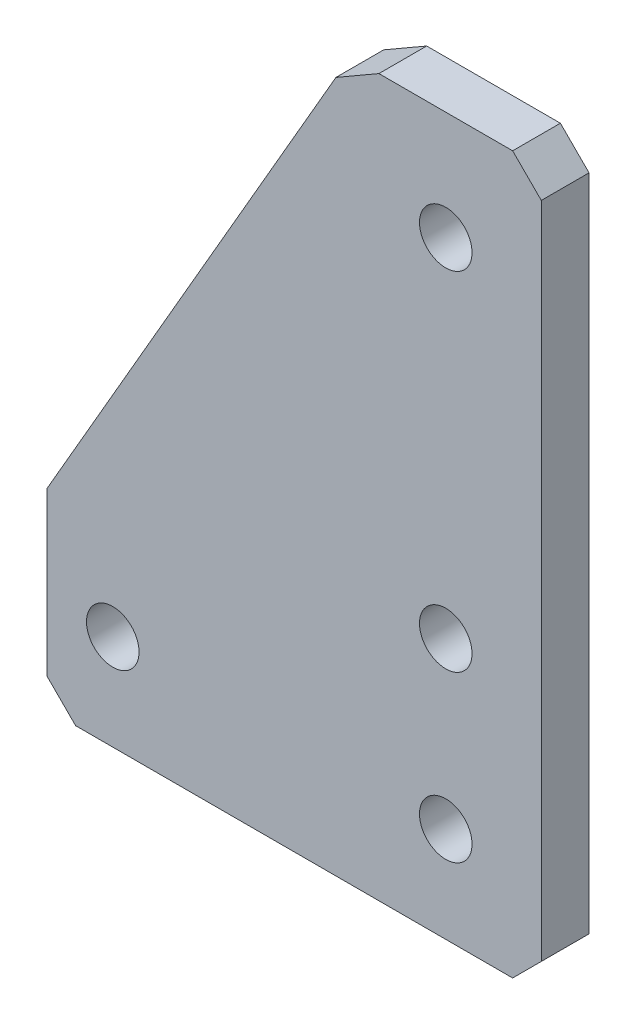
ISO-10303-21;
HEADER;
FILE_DESCRIPTION(('STEP AP214'),'2;1');
FILE_NAME('part.step','',(''),(''),'','','');
FILE_SCHEMA(('AUTOMOTIVE_DESIGN { 1 0 10303 214 1 1 1 1 }'));
ENDSEC;
DATA;
#1=APPLICATION_CONTEXT('core data for automotive mechanical design processes');
#2=APPLICATION_PROTOCOL_DEFINITION('international standard','automotive_design',2000,#1);
#3=PRODUCT_CONTEXT('',#1,'mechanical');
#4=PRODUCT('Part','Part','',(#3));
#5=PRODUCT_RELATED_PRODUCT_CATEGORY('part','',(#4));
#6=PRODUCT_DEFINITION_FORMATION('','',#4);
#7=PRODUCT_DEFINITION_CONTEXT('part definition',#1,'design');
#8=PRODUCT_DEFINITION('design','',#6,#7);
#9=PRODUCT_DEFINITION_SHAPE('','',#8);
#10=(LENGTH_UNIT() NAMED_UNIT(*) SI_UNIT(.MILLI.,.METRE.));
#11=(NAMED_UNIT(*) PLANE_ANGLE_UNIT() SI_UNIT($,.RADIAN.));
#12=(NAMED_UNIT(*) SI_UNIT($,.STERADIAN.) SOLID_ANGLE_UNIT());
#13=UNCERTAINTY_MEASURE_WITH_UNIT(LENGTH_MEASURE(1.E-05),#10,'distance_accuracy_value','');
#14=(GEOMETRIC_REPRESENTATION_CONTEXT(3) GLOBAL_UNCERTAINTY_ASSIGNED_CONTEXT((#13)) GLOBAL_UNIT_ASSIGNED_CONTEXT((#10,
#11,#12)) REPRESENTATION_CONTEXT('',''));
#15=CARTESIAN_POINT('',(0.,0.,0.));
#16=DIRECTION('',(0.,0.,1.));
#17=DIRECTION('',(1.,0.,0.));
#18=AXIS2_PLACEMENT_3D('',#15,#16,#17);
#19=CARTESIAN_POINT('',(445.331056745974,-91.9406540029195,842.256699137521));
#20=DIRECTION('',(1.,0.,0.));
#21=DIRECTION('',(0.,0.,-1.));
#22=AXIS2_PLACEMENT_3D('',#19,#20,#21);
#23=PLANE('',#22);
#24=DIRECTION('',(0.,1.,0.));
#25=VECTOR('',#24,1.);
#26=CARTESIAN_POINT('',(445.331056745974,-91.9406540029195,847.256699137521));
#27=LINE('',#26,#25);
#28=CARTESIAN_POINT('',(445.331056745974,-88.9406540029196,847.256699137521));
#29=VERTEX_POINT('',#28);
#30=CARTESIAN_POINT('',(445.331056745974,-19.9406540029195,847.256699137521));
#31=VERTEX_POINT('',#30);
#32=EDGE_CURVE('E152',#29,#31,#27,.T.);
#33=ORIENTED_EDGE('',*,*,#32,.F.);
#34=DIRECTION('',(0.,0.,-1.));
#35=VECTOR('',#34,1.);
#36=CARTESIAN_POINT('',(445.331056745974,-88.9406540029196,842.256699137521));
#37=LINE('',#36,#35);
#38=CARTESIAN_POINT('',(445.331056745974,-88.9406540029196,842.256699137521));
#39=VERTEX_POINT('',#38);
#40=EDGE_CURVE('E181',#29,#39,#37,.T.);
#41=ORIENTED_EDGE('',*,*,#40,.T.);
#42=DIRECTION('',(0.,1.,0.));
#43=VECTOR('',#42,1.);
#44=CARTESIAN_POINT('',(445.331056745974,-91.9406540029195,842.256699137521));
#45=LINE('',#44,#43);
#46=CARTESIAN_POINT('',(445.331056745974,-19.9406540029195,842.256699137521));
#47=VERTEX_POINT('',#46);
#48=EDGE_CURVE('E164',#39,#47,#45,.T.);
#49=ORIENTED_EDGE('',*,*,#48,.T.);
#50=DIRECTION('',(0.,0.,1.));
#51=VECTOR('',#50,1.);
#52=CARTESIAN_POINT('',(445.331056745974,-19.9406540029195,842.256699137521));
#53=LINE('',#52,#51);
#54=EDGE_CURVE('E178',#47,#31,#53,.T.);
#55=ORIENTED_EDGE('',*,*,#54,.T.);
#56=EDGE_LOOP('',(#33,#41,#49,#55));
#57=FACE_BOUND('',#56,.T.);
#58=ADVANCED_FACE('F51',(#57),#23,.T.);
#59=CARTESIAN_POINT('',(393.576791940545,-91.9406540029195,842.256699137521));
#60=DIRECTION('',(0.,-1.,0.));
#61=DIRECTION('',(1.,0.,0.));
#62=AXIS2_PLACEMENT_3D('',#59,#60,#61);
#63=PLANE('',#62);
#64=DIRECTION('',(1.,0.,0.));
#65=VECTOR('',#64,1.);
#66=CARTESIAN_POINT('',(393.576791940545,-91.9406540029195,842.256699137521));
#67=LINE('',#66,#65);
#68=CARTESIAN_POINT('',(396.576791940545,-91.9406540029195,842.256699137521));
#69=VERTEX_POINT('',#68);
#70=CARTESIAN_POINT('',(442.331056745974,-91.9406540029195,842.256699137521));
#71=VERTEX_POINT('',#70);
#72=EDGE_CURVE('E140',#69,#71,#67,.T.);
#73=ORIENTED_EDGE('',*,*,#72,.T.);
#74=DIRECTION('',(0.,0.,1.));
#75=VECTOR('',#74,1.);
#76=CARTESIAN_POINT('',(442.331056745974,-91.9406540029195,842.256699137521));
#77=LINE('',#76,#75);
#78=CARTESIAN_POINT('',(442.331056745974,-91.9406540029195,847.256699137521));
#79=VERTEX_POINT('',#78);
#80=EDGE_CURVE('E167',#71,#79,#77,.T.);
#81=ORIENTED_EDGE('',*,*,#80,.T.);
#82=DIRECTION('',(1.,0.,0.));
#83=VECTOR('',#82,1.);
#84=CARTESIAN_POINT('',(393.576791940545,-91.9406540029195,847.256699137521));
#85=LINE('',#84,#83);
#86=CARTESIAN_POINT('',(396.576791940545,-91.9406540029195,847.256699137521));
#87=VERTEX_POINT('',#86);
#88=EDGE_CURVE('E162',#87,#79,#85,.T.);
#89=ORIENTED_EDGE('',*,*,#88,.F.);
#90=DIRECTION('',(0.,0.,-1.));
#91=VECTOR('',#90,1.);
#92=CARTESIAN_POINT('',(396.576791940545,-91.9406540029195,842.256699137521));
#93=LINE('',#92,#91);
#94=EDGE_CURVE('E139',#87,#69,#93,.T.);
#95=ORIENTED_EDGE('',*,*,#94,.T.);
#96=EDGE_LOOP('',(#73,#81,#89,#95));
#97=FACE_BOUND('',#96,.T.);
#98=ADVANCED_FACE('F265',(#97),#63,.T.);
#99=CARTESIAN_POINT('',(393.576791940545,-71.9406540029195,842.256699137521));
#100=DIRECTION('',(-1.,0.,0.));
#101=DIRECTION('',(0.,-1.,0.));
#102=AXIS2_PLACEMENT_3D('',#99,#100,#101);
#103=PLANE('',#102);
#104=DIRECTION('',(0.,-1.,0.));
#105=VECTOR('',#104,1.);
#106=CARTESIAN_POINT('',(393.576791940545,-71.9406540029195,842.256699137521));
#107=LINE('',#106,#105);
#108=CARTESIAN_POINT('',(393.576791940545,-71.9406540029195,842.256699137521));
#109=VERTEX_POINT('',#108);
#110=CARTESIAN_POINT('',(393.576791940545,-88.9406540029195,842.256699137521));
#111=VERTEX_POINT('',#110);
#112=EDGE_CURVE('E129',#109,#111,#107,.T.);
#113=ORIENTED_EDGE('',*,*,#112,.T.);
#114=DIRECTION('',(0.,0.,1.));
#115=VECTOR('',#114,1.);
#116=CARTESIAN_POINT('',(393.576791940545,-88.9406540029195,842.256699137521));
#117=LINE('',#116,#115);
#118=CARTESIAN_POINT('',(393.576791940545,-88.9406540029195,847.256699137521));
#119=VERTEX_POINT('',#118);
#120=EDGE_CURVE('E189',#111,#119,#117,.T.);
#121=ORIENTED_EDGE('',*,*,#120,.T.);
#122=DIRECTION('',(0.,-1.,0.));
#123=VECTOR('',#122,1.);
#124=CARTESIAN_POINT('',(393.576791940545,-71.9406540029195,847.256699137521));
#125=LINE('',#124,#123);
#126=CARTESIAN_POINT('',(393.576791940545,-71.9406540029195,847.256699137521));
#127=VERTEX_POINT('',#126);
#128=EDGE_CURVE('E138',#127,#119,#125,.T.);
#129=ORIENTED_EDGE('',*,*,#128,.F.);
#130=DIRECTION('',(0.,0.,1.));
#131=VECTOR('',#130,1.);
#132=CARTESIAN_POINT('',(393.576791940545,-71.9406540029195,842.256699137521));
#133=LINE('',#132,#131);
#134=EDGE_CURVE('E125',#109,#127,#133,.T.);
#135=ORIENTED_EDGE('',*,*,#134,.F.);
#136=EDGE_LOOP('',(#113,#121,#129,#135));
#137=FACE_BOUND('',#136,.T.);
#138=ADVANCED_FACE('F134',(#137),#103,.T.);
#139=CARTESIAN_POINT('',(425.331056745974,-16.9406540029195,842.256699137521));
#140=DIRECTION('',(-0.866025403784438,0.5,0.));
#141=DIRECTION('',(-0.5,-0.866025403784438,0.));
#142=AXIS2_PLACEMENT_3D('',#139,#140,#141);
#143=PLANE('',#142);
#144=DIRECTION('',(-0.5,-0.866025403784438,0.));
#145=VECTOR('',#144,1.);
#146=CARTESIAN_POINT('',(425.331056745974,-16.9406540029195,847.256699137521));
#147=LINE('',#146,#145);
#148=CARTESIAN_POINT('',(423.831056745974,-19.5387302142728,847.256699137521));
#149=VERTEX_POINT('',#148);
#150=EDGE_CURVE('E159',#149,#127,#147,.T.);
#151=ORIENTED_EDGE('',*,*,#150,.F.);
#152=DIRECTION('',(0.,0.,-1.));
#153=VECTOR('',#152,1.);
#154=CARTESIAN_POINT('',(423.831056745974,-19.5387302142728,842.256699137521));
#155=LINE('',#154,#153);
#156=CARTESIAN_POINT('',(423.831056745974,-19.5387302142728,842.256699137521));
#157=VERTEX_POINT('',#156);
#158=EDGE_CURVE('E13',#149,#157,#155,.T.);
#159=ORIENTED_EDGE('',*,*,#158,.T.);
#160=DIRECTION('',(-0.5,-0.866025403784438,0.));
#161=VECTOR('',#160,1.);
#162=CARTESIAN_POINT('',(425.331056745974,-16.9406540029195,842.256699137521));
#163=LINE('',#162,#161);
#164=EDGE_CURVE('E121',#157,#109,#163,.T.);
#165=ORIENTED_EDGE('',*,*,#164,.T.);
#166=ORIENTED_EDGE('',*,*,#134,.T.);
#167=EDGE_LOOP('',(#151,#159,#165,#166));
#168=FACE_BOUND('',#167,.T.);
#169=ADVANCED_FACE('F124',(#168),#143,.T.);
#170=CARTESIAN_POINT('',(445.331056745974,-16.9406540029195,842.256699137521));
#171=DIRECTION('',(0.,1.,0.));
#172=DIRECTION('',(-1.,0.,0.));
#173=AXIS2_PLACEMENT_3D('',#170,#171,#172);
#174=PLANE('',#173);
#175=DIRECTION('',(-1.,0.,0.));
#176=VECTOR('',#175,1.);
#177=CARTESIAN_POINT('',(445.331056745974,-16.9406540029195,847.256699137521));
#178=LINE('',#177,#176);
#179=CARTESIAN_POINT('',(442.331056745974,-16.9406540029195,847.256699137521));
#180=VERTEX_POINT('',#179);
#181=CARTESIAN_POINT('',(428.331056745974,-16.9406540029195,847.256699137521));
#182=VERTEX_POINT('',#181);
#183=EDGE_CURVE('E155',#180,#182,#178,.T.);
#184=ORIENTED_EDGE('',*,*,#183,.F.);
#185=DIRECTION('',(0.,0.,-1.));
#186=VECTOR('',#185,1.);
#187=CARTESIAN_POINT('',(442.331056745974,-16.9406540029195,842.256699137521));
#188=LINE('',#187,#186);
#189=CARTESIAN_POINT('',(442.331056745974,-16.9406540029195,842.256699137521));
#190=VERTEX_POINT('',#189);
#191=EDGE_CURVE('E59',#180,#190,#188,.T.);
#192=ORIENTED_EDGE('',*,*,#191,.T.);
#193=DIRECTION('',(-1.,0.,0.));
#194=VECTOR('',#193,1.);
#195=CARTESIAN_POINT('',(445.331056745974,-16.9406540029195,842.256699137521));
#196=LINE('',#195,#194);
#197=CARTESIAN_POINT('',(428.331056745974,-16.9406540029195,842.256699137521));
#198=VERTEX_POINT('',#197);
#199=EDGE_CURVE('E130',#190,#198,#196,.T.);
#200=ORIENTED_EDGE('',*,*,#199,.T.);
#201=DIRECTION('',(0.,0.,1.));
#202=VECTOR('',#201,1.);
#203=CARTESIAN_POINT('',(428.331056745974,-16.9406540029195,842.256699137521));
#204=LINE('',#203,#202);
#205=EDGE_CURVE('E191',#198,#182,#204,.T.);
#206=ORIENTED_EDGE('',*,*,#205,.T.);
#207=EDGE_LOOP('',(#184,#192,#200,#206));
#208=FACE_BOUND('',#207,.T.);
#209=ADVANCED_FACE('F194',(#208),#174,.T.);
#210=CARTESIAN_POINT('',(0.,0.,842.256699137521));
#211=DIRECTION('',(0.,0.,1.));
#212=DIRECTION('',(1.,0.,0.));
#213=AXIS2_PLACEMENT_3D('',#210,#211,#212);
#214=PLANE('',#213);
#215=CARTESIAN_POINT('',(435.331056745974,-81.9406540029195,842.256699137521));
#216=DIRECTION('',(0.,0.,1.));
#217=DIRECTION('',(-1.,0.,0.));
#218=AXIS2_PLACEMENT_3D('',#215,#216,#217);
#219=CIRCLE('',#218,2.74999999999998);
#220=CARTESIAN_POINT('',(432.581056745974,-81.9406540029195,842.256699137521));
#221=VERTEX_POINT('',#220);
#222=EDGE_CURVE('E224',#221,#221,#219,.T.);
#223=ORIENTED_EDGE('',*,*,#222,.T.);
#224=EDGE_LOOP('',(#223));
#225=FACE_BOUND('',#224,.T.);
#226=CARTESIAN_POINT('',(400.469639923236,-81.9406540029195,842.256699137521));
#227=DIRECTION('',(0.,0.,1.));
#228=DIRECTION('',(-1.,0.,0.));
#229=AXIS2_PLACEMENT_3D('',#226,#227,#228);
#230=CIRCLE('',#229,2.74999999999998);
#231=CARTESIAN_POINT('',(397.719639923236,-81.9406540029195,842.256699137521));
#232=VERTEX_POINT('',#231);
#233=EDGE_CURVE('E218',#232,#232,#230,.T.);
#234=ORIENTED_EDGE('',*,*,#233,.T.);
#235=EDGE_LOOP('',(#234));
#236=FACE_BOUND('',#235,.T.);
#237=CARTESIAN_POINT('',(435.331056745974,-64.6632370984621,842.256699137521));
#238=DIRECTION('',(0.,0.,1.));
#239=DIRECTION('',(-1.,0.,0.));
#240=AXIS2_PLACEMENT_3D('',#237,#238,#239);
#241=CIRCLE('',#240,2.74999999999998);
#242=CARTESIAN_POINT('',(432.581056745974,-64.6632370984621,842.256699137521));
#243=VERTEX_POINT('',#242);
#244=EDGE_CURVE('E212',#243,#243,#241,.T.);
#245=ORIENTED_EDGE('',*,*,#244,.T.);
#246=EDGE_LOOP('',(#245));
#247=FACE_BOUND('',#246,.T.);
#248=CARTESIAN_POINT('',(435.331056745974,-28.3116830206649,842.256699137521));
#249=DIRECTION('',(0.,0.,1.));
#250=DIRECTION('',(-1.,0.,0.));
#251=AXIS2_PLACEMENT_3D('',#248,#249,#250);
#252=CIRCLE('',#251,2.74999999999998);
#253=CARTESIAN_POINT('',(432.581056745974,-28.3116830206649,842.256699137521));
#254=VERTEX_POINT('',#253);
#255=EDGE_CURVE('E156',#254,#254,#252,.T.);
#256=ORIENTED_EDGE('',*,*,#255,.T.);
#257=EDGE_LOOP('',(#256));
#258=FACE_BOUND('',#257,.T.);
#259=ORIENTED_EDGE('',*,*,#48,.F.);
#260=DIRECTION('',(0.707106781186549,0.707106781186546,0.));
#261=VECTOR('',#260,1.);
#262=CARTESIAN_POINT('',(442.331056745974,-91.9406540029195,842.256699137521));
#263=LINE('',#262,#261);
#264=EDGE_CURVE('E187',#39,#71,#263,.F.);
#265=ORIENTED_EDGE('',*,*,#264,.T.);
#266=ORIENTED_EDGE('',*,*,#72,.F.);
#267=DIRECTION('',(0.707106781186549,-0.707106781186546,0.));
#268=VECTOR('',#267,1.);
#269=CARTESIAN_POINT('',(393.576791940545,-88.9406540029195,842.256699137521));
#270=LINE('',#269,#268);
#271=EDGE_CURVE('E146',#69,#111,#270,.F.);
#272=ORIENTED_EDGE('',*,*,#271,.T.);
#273=ORIENTED_EDGE('',*,*,#112,.F.);
#274=ORIENTED_EDGE('',*,*,#164,.F.);
#275=DIRECTION('',(-0.866025403784439,-0.499999999999999,0.));
#276=VECTOR('',#275,1.);
#277=CARTESIAN_POINT('',(428.331056745974,-16.9406540029195,842.256699137521));
#278=LINE('',#277,#276);
#279=EDGE_CURVE('E66',#157,#198,#278,.F.);
#280=ORIENTED_EDGE('',*,*,#279,.T.);
#281=ORIENTED_EDGE('',*,*,#199,.F.);
#282=DIRECTION('',(-0.707106781186548,0.707106781186548,0.));
#283=VECTOR('',#282,1.);
#284=CARTESIAN_POINT('',(445.331056745974,-19.9406540029195,842.256699137521));
#285=LINE('',#284,#283);
#286=EDGE_CURVE('E184',#190,#47,#285,.F.);
#287=ORIENTED_EDGE('',*,*,#286,.T.);
#288=EDGE_LOOP('',(#259,#265,#266,#272,#273,#274,#280,#281,#287));
#289=FACE_BOUND('',#288,.T.);
#290=ADVANCED_FACE('F143',(#225,#236,#247,#258,#289),#214,.F.);
#291=CARTESIAN_POINT('',(0.,0.,847.256699137521));
#292=DIRECTION('',(0.,0.,1.));
#293=DIRECTION('',(1.,0.,0.));
#294=AXIS2_PLACEMENT_3D('',#291,#292,#293);
#295=PLANE('',#294);
#296=CARTESIAN_POINT('',(435.331056745974,-81.9406540029195,847.256699137521));
#297=DIRECTION('',(0.,0.,1.));
#298=DIRECTION('',(-1.,0.,0.));
#299=AXIS2_PLACEMENT_3D('',#296,#297,#298);
#300=CIRCLE('',#299,2.74999999999998);
#301=CARTESIAN_POINT('',(432.581056745974,-81.9406540029195,847.256699137521));
#302=VERTEX_POINT('',#301);
#303=EDGE_CURVE('E227',#302,#302,#300,.T.);
#304=ORIENTED_EDGE('',*,*,#303,.F.);
#305=EDGE_LOOP('',(#304));
#306=FACE_BOUND('',#305,.T.);
#307=CARTESIAN_POINT('',(400.469639923236,-81.9406540029195,847.256699137521));
#308=DIRECTION('',(0.,0.,1.));
#309=DIRECTION('',(-1.,0.,0.));
#310=AXIS2_PLACEMENT_3D('',#307,#308,#309);
#311=CIRCLE('',#310,2.74999999999998);
#312=CARTESIAN_POINT('',(397.719639923236,-81.9406540029195,847.256699137521));
#313=VERTEX_POINT('',#312);
#314=EDGE_CURVE('E221',#313,#313,#311,.T.);
#315=ORIENTED_EDGE('',*,*,#314,.F.);
#316=EDGE_LOOP('',(#315));
#317=FACE_BOUND('',#316,.T.);
#318=CARTESIAN_POINT('',(435.331056745974,-64.6632370984621,847.256699137521));
#319=DIRECTION('',(0.,0.,1.));
#320=DIRECTION('',(-1.,0.,0.));
#321=AXIS2_PLACEMENT_3D('',#318,#319,#320);
#322=CIRCLE('',#321,2.74999999999998);
#323=CARTESIAN_POINT('',(432.581056745974,-64.6632370984621,847.256699137521));
#324=VERTEX_POINT('',#323);
#325=EDGE_CURVE('E215',#324,#324,#322,.T.);
#326=ORIENTED_EDGE('',*,*,#325,.F.);
#327=EDGE_LOOP('',(#326));
#328=FACE_BOUND('',#327,.T.);
#329=CARTESIAN_POINT('',(435.331056745974,-28.3116830206649,847.256699137521));
#330=DIRECTION('',(0.,0.,1.));
#331=DIRECTION('',(-1.,0.,0.));
#332=AXIS2_PLACEMENT_3D('',#329,#330,#331);
#333=CIRCLE('',#332,2.74999999999998);
#334=CARTESIAN_POINT('',(432.581056745974,-28.3116830206649,847.256699137521));
#335=VERTEX_POINT('',#334);
#336=EDGE_CURVE('E209',#335,#335,#333,.T.);
#337=ORIENTED_EDGE('',*,*,#336,.F.);
#338=EDGE_LOOP('',(#337));
#339=FACE_BOUND('',#338,.T.);
#340=ORIENTED_EDGE('',*,*,#88,.T.);
#341=DIRECTION('',(-0.707106781186549,-0.707106781186546,0.));
#342=VECTOR('',#341,1.);
#343=CARTESIAN_POINT('',(267.135855374446,-267.135855374447,847.256699137521));
#344=LINE('',#343,#342);
#345=EDGE_CURVE('E176',#79,#29,#344,.F.);
#346=ORIENTED_EDGE('',*,*,#345,.T.);
#347=ORIENTED_EDGE('',*,*,#32,.T.);
#348=DIRECTION('',(0.707106781186548,-0.707106781186548,0.));
#349=VECTOR('',#348,1.);
#350=CARTESIAN_POINT('',(212.695201371527,212.695201371527,847.256699137521));
#351=LINE('',#350,#349);
#352=EDGE_CURVE('E172',#31,#180,#351,.F.);
#353=ORIENTED_EDGE('',*,*,#352,.T.);
#354=ORIENTED_EDGE('',*,*,#183,.T.);
#355=DIRECTION('',(0.866025403784439,0.499999999999999,0.));
#356=VECTOR('',#355,1.);
#357=CARTESIAN_POINT('',(114.418282548118,-198.178278688113,847.256699137521));
#358=LINE('',#357,#356);
#359=EDGE_CURVE('E170',#182,#149,#358,.F.);
#360=ORIENTED_EDGE('',*,*,#359,.T.);
#361=ORIENTED_EDGE('',*,*,#150,.T.);
#362=ORIENTED_EDGE('',*,*,#128,.T.);
#363=DIRECTION('',(-0.707106781186549,0.707106781186546,0.));
#364=VECTOR('',#363,1.);
#365=CARTESIAN_POINT('',(152.318068968812,152.318068968812,847.256699137521));
#366=LINE('',#365,#364);
#367=EDGE_CURVE('E174',#119,#87,#366,.F.);
#368=ORIENTED_EDGE('',*,*,#367,.T.);
#369=EDGE_LOOP('',(#340,#346,#347,#353,#354,#360,#361,#362,#368));
#370=FACE_BOUND('',#369,.T.);
#371=ADVANCED_FACE('F197',(#306,#317,#328,#339,#370),#295,.T.);
#372=CARTESIAN_POINT('',(435.331056745974,-28.3116830206649,842.256699137521));
#373=DIRECTION('',(0.,0.,1.));
#374=DIRECTION('',(1.,0.,0.));
#375=AXIS2_PLACEMENT_3D('',#372,#373,#374);
#376=CYLINDRICAL_SURFACE('',#375,2.74999999999998);
#377=ORIENTED_EDGE('',*,*,#255,.F.);
#378=EDGE_LOOP('',(#377));
#379=FACE_BOUND('',#378,.T.);
#380=ORIENTED_EDGE('',*,*,#336,.T.);
#381=EDGE_LOOP('',(#380));
#382=FACE_BOUND('',#381,.T.);
#383=ADVANCED_FACE('F245',(#379,#382),#376,.F.);
#384=CARTESIAN_POINT('',(435.331056745974,-64.6632370984621,842.256699137521));
#385=DIRECTION('',(0.,0.,1.));
#386=DIRECTION('',(1.,0.,0.));
#387=AXIS2_PLACEMENT_3D('',#384,#385,#386);
#388=CYLINDRICAL_SURFACE('',#387,2.74999999999998);
#389=ORIENTED_EDGE('',*,*,#244,.F.);
#390=EDGE_LOOP('',(#389));
#391=FACE_BOUND('',#390,.T.);
#392=ORIENTED_EDGE('',*,*,#325,.T.);
#393=EDGE_LOOP('',(#392));
#394=FACE_BOUND('',#393,.T.);
#395=ADVANCED_FACE('F254',(#391,#394),#388,.F.);
#396=CARTESIAN_POINT('',(400.469639923236,-81.9406540029195,842.256699137521));
#397=DIRECTION('',(0.,0.,1.));
#398=DIRECTION('',(1.,0.,0.));
#399=AXIS2_PLACEMENT_3D('',#396,#397,#398);
#400=CYLINDRICAL_SURFACE('',#399,2.74999999999998);
#401=ORIENTED_EDGE('',*,*,#233,.F.);
#402=EDGE_LOOP('',(#401));
#403=FACE_BOUND('',#402,.T.);
#404=ORIENTED_EDGE('',*,*,#314,.T.);
#405=EDGE_LOOP('',(#404));
#406=FACE_BOUND('',#405,.T.);
#407=ADVANCED_FACE('F239',(#403,#406),#400,.F.);
#408=CARTESIAN_POINT('',(435.331056745974,-81.9406540029195,842.256699137521));
#409=DIRECTION('',(0.,0.,1.));
#410=DIRECTION('',(1.,0.,0.));
#411=AXIS2_PLACEMENT_3D('',#408,#409,#410);
#412=CYLINDRICAL_SURFACE('',#411,2.74999999999998);
#413=ORIENTED_EDGE('',*,*,#222,.F.);
#414=EDGE_LOOP('',(#413));
#415=FACE_BOUND('',#414,.T.);
#416=ORIENTED_EDGE('',*,*,#303,.T.);
#417=EDGE_LOOP('',(#416));
#418=FACE_BOUND('',#417,.T.);
#419=ADVANCED_FACE('F235',(#415,#418),#412,.F.);
#420=CARTESIAN_POINT('',(442.331056745974,-91.9406540029195,842.256699137521));
#421=DIRECTION('',(-0.707106781186546,0.707106781186549,0.));
#422=DIRECTION('',(0.,0.,1.));
#423=AXIS2_PLACEMENT_3D('',#420,#421,#422);
#424=PLANE('',#423);
#425=ORIENTED_EDGE('',*,*,#264,.F.);
#426=ORIENTED_EDGE('',*,*,#40,.F.);
#427=ORIENTED_EDGE('',*,*,#345,.F.);
#428=ORIENTED_EDGE('',*,*,#80,.F.);
#429=EDGE_LOOP('',(#425,#426,#427,#428));
#430=FACE_BOUND('',#429,.T.);
#431=ADVANCED_FACE('F238',(#430),#424,.F.);
#432=CARTESIAN_POINT('',(393.576791940545,-88.9406540029195,842.256699137521));
#433=DIRECTION('',(0.707106781186546,0.707106781186549,0.));
#434=DIRECTION('',(0.,0.,1.));
#435=AXIS2_PLACEMENT_3D('',#432,#433,#434);
#436=PLANE('',#435);
#437=ORIENTED_EDGE('',*,*,#271,.F.);
#438=ORIENTED_EDGE('',*,*,#94,.F.);
#439=ORIENTED_EDGE('',*,*,#367,.F.);
#440=ORIENTED_EDGE('',*,*,#120,.F.);
#441=EDGE_LOOP('',(#437,#438,#439,#440));
#442=FACE_BOUND('',#441,.T.);
#443=ADVANCED_FACE('F277',(#442),#436,.F.);
#444=CARTESIAN_POINT('',(445.331056745974,-19.9406540029195,842.256699137521));
#445=DIRECTION('',(-0.707106781186547,-0.707106781186547,0.));
#446=DIRECTION('',(0.,0.,1.));
#447=AXIS2_PLACEMENT_3D('',#444,#445,#446);
#448=PLANE('',#447);
#449=ORIENTED_EDGE('',*,*,#286,.F.);
#450=ORIENTED_EDGE('',*,*,#191,.F.);
#451=ORIENTED_EDGE('',*,*,#352,.F.);
#452=ORIENTED_EDGE('',*,*,#54,.F.);
#453=EDGE_LOOP('',(#449,#450,#451,#452));
#454=FACE_BOUND('',#453,.T.);
#455=ADVANCED_FACE('F202',(#454),#448,.F.);
#456=CARTESIAN_POINT('',(428.331056745974,-16.9406540029195,842.256699137521));
#457=DIRECTION('',(0.499999999999999,-0.866025403784439,0.));
#458=DIRECTION('',(0.,0.,1.));
#459=AXIS2_PLACEMENT_3D('',#456,#457,#458);
#460=PLANE('',#459);
#461=ORIENTED_EDGE('',*,*,#279,.F.);
#462=ORIENTED_EDGE('',*,*,#158,.F.);
#463=ORIENTED_EDGE('',*,*,#359,.F.);
#464=ORIENTED_EDGE('',*,*,#205,.F.);
#465=EDGE_LOOP('',(#461,#462,#463,#464));
#466=FACE_BOUND('',#465,.T.);
#467=ADVANCED_FACE('F53',(#466),#460,.F.);
#468=CLOSED_SHELL('',(#58,#98,#138,#169,#209,#290,#371,#383,#395,#407,#419,#431,#443,#455,#467));
#469=MANIFOLD_SOLID_BREP('B2',#468);
#470=ADVANCED_BREP_SHAPE_REPRESENTATION('',(#18,#469),#14);
#471=SHAPE_DEFINITION_REPRESENTATION(#9,#470);
ENDSEC;
END-ISO-10303-21;
